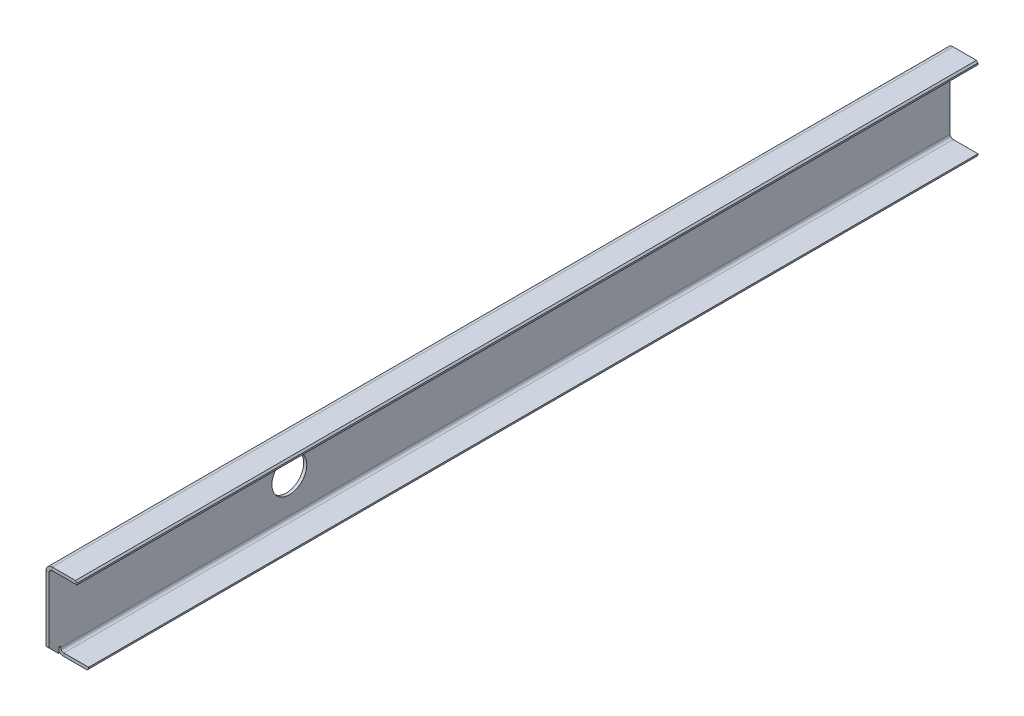
ISO-10303-21;
HEADER;
FILE_DESCRIPTION(('STEP AP214'),'2;1');
FILE_NAME('part.step','',(''),(''),'','','');
FILE_SCHEMA(('AUTOMOTIVE_DESIGN { 1 0 10303 214 1 1 1 1 }'));
ENDSEC;
DATA;
#1=APPLICATION_CONTEXT('core data for automotive mechanical design processes');
#2=APPLICATION_PROTOCOL_DEFINITION('international standard','automotive_design',2000,#1);
#3=PRODUCT_CONTEXT('',#1,'mechanical');
#4=PRODUCT('Part','Part','',(#3));
#5=PRODUCT_RELATED_PRODUCT_CATEGORY('part','',(#4));
#6=PRODUCT_DEFINITION_FORMATION('','',#4);
#7=PRODUCT_DEFINITION_CONTEXT('part definition',#1,'design');
#8=PRODUCT_DEFINITION('design','',#6,#7);
#9=PRODUCT_DEFINITION_SHAPE('','',#8);
#10=(LENGTH_UNIT() NAMED_UNIT(*) SI_UNIT(.MILLI.,.METRE.));
#11=(NAMED_UNIT(*) PLANE_ANGLE_UNIT() SI_UNIT($,.RADIAN.));
#12=(NAMED_UNIT(*) SI_UNIT($,.STERADIAN.) SOLID_ANGLE_UNIT());
#13=UNCERTAINTY_MEASURE_WITH_UNIT(LENGTH_MEASURE(1.E-05),#10,'distance_accuracy_value','');
#14=(GEOMETRIC_REPRESENTATION_CONTEXT(3) GLOBAL_UNCERTAINTY_ASSIGNED_CONTEXT((#13)) GLOBAL_UNIT_ASSIGNED_CONTEXT((#10,
#11,#12)) REPRESENTATION_CONTEXT('',''));
#15=CARTESIAN_POINT('',(0.,0.,0.));
#16=DIRECTION('',(0.,0.,1.));
#17=DIRECTION('',(1.,0.,0.));
#18=AXIS2_PLACEMENT_3D('',#15,#16,#17);
#19=CARTESIAN_POINT('',(-8.,0.,0.));
#20=DIRECTION('',(-1.,0.,0.));
#21=DIRECTION('',(0.,0.,1.));
#22=AXIS2_PLACEMENT_3D('',#19,#20,#21);
#23=PLANE('',#22);
#24=CARTESIAN_POINT('',(-8.00000000000007,-107.5,-620.));
#25=DIRECTION('',(1.,0.,0.));
#26=DIRECTION('',(0.,0.,-1.));
#27=AXIS2_PLACEMENT_3D('',#24,#25,#26);
#28=CIRCLE('',#27,45.0000000000001);
#29=CARTESIAN_POINT('',(-8.00000000000007,-107.5,-665.));
#30=VERTEX_POINT('',#29);
#31=EDGE_CURVE('E255',#30,#30,#28,.T.);
#32=ORIENTED_EDGE('',*,*,#31,.T.);
#33=EDGE_LOOP('',(#32));
#34=FACE_BOUND('',#33,.T.);
#35=DIRECTION('',(0.,1.,0.));
#36=VECTOR('',#35,1.);
#37=CARTESIAN_POINT('',(-8.,0.,-2325.));
#38=LINE('',#37,#36);
#39=CARTESIAN_POINT('',(-8.00000000000007,-199.,-2325.));
#40=VERTEX_POINT('',#39);
#41=CARTESIAN_POINT('',(-8.,-16.,-2325.));
#42=VERTEX_POINT('',#41);
#43=EDGE_CURVE('E354',#40,#42,#38,.T.);
#44=ORIENTED_EDGE('',*,*,#43,.F.);
#45=DIRECTION('',(0.,0.,-1.));
#46=VECTOR('',#45,1.);
#47=CARTESIAN_POINT('',(-8.00000000000007,-199.,-2325.));
#48=LINE('',#47,#46);
#49=CARTESIAN_POINT('',(-8.,-199.,-30.0000000000002));
#50=VERTEX_POINT('',#49);
#51=EDGE_CURVE('E208',#40,#50,#48,.F.);
#52=ORIENTED_EDGE('',*,*,#51,.T.);
#53=DIRECTION('',(0.,1.,0.));
#54=VECTOR('',#53,1.);
#55=CARTESIAN_POINT('',(-8.,0.,-30.0000000000002));
#56=LINE('',#55,#54);
#57=CARTESIAN_POINT('',(-8.,-195.,-30.0000000000002));
#58=VERTEX_POINT('',#57);
#59=EDGE_CURVE('E344',#50,#58,#56,.T.);
#60=ORIENTED_EDGE('',*,*,#59,.T.);
#61=DIRECTION('',(0.,0.,1.));
#62=VECTOR('',#61,1.);
#63=CARTESIAN_POINT('',(-8.,-195.,0.));
#64=LINE('',#63,#62);
#65=CARTESIAN_POINT('',(-8.,-195.,-26.0000000000002));
#66=VERTEX_POINT('',#65);
#67=EDGE_CURVE('E341',#58,#66,#64,.T.);
#68=ORIENTED_EDGE('',*,*,#67,.T.);
#69=DIRECTION('',(0.,-1.,0.));
#70=VECTOR('',#69,1.);
#71=CARTESIAN_POINT('',(-8.,0.,-26.0000000000002));
#72=LINE('',#71,#70);
#73=CARTESIAN_POINT('',(-8.,-211.,-26.0000000000003));
#74=VERTEX_POINT('',#73);
#75=EDGE_CURVE('E326',#66,#74,#72,.T.);
#76=ORIENTED_EDGE('',*,*,#75,.T.);
#77=DIRECTION('',(0.,-0.707106781186547,-0.707106781186547));
#78=VECTOR('',#77,1.);
#79=CARTESIAN_POINT('',(-8.,-215.,-30.));
#80=LINE('',#79,#78);
#81=CARTESIAN_POINT('',(-8.,-185.,0.));
#82=VERTEX_POINT('',#81);
#83=EDGE_CURVE('E350',#82,#74,#80,.T.);
#84=ORIENTED_EDGE('',*,*,#83,.F.);
#85=DIRECTION('',(0.,-1.,0.));
#86=VECTOR('',#85,1.);
#87=CARTESIAN_POINT('',(-8.,-185.,0.));
#88=LINE('',#87,#86);
#89=CARTESIAN_POINT('',(-8.,-16.,0.));
#90=VERTEX_POINT('',#89);
#91=EDGE_CURVE('E348',#90,#82,#88,.T.);
#92=ORIENTED_EDGE('',*,*,#91,.F.);
#93=DIRECTION('',(0.,0.,1.));
#94=VECTOR('',#93,1.);
#95=CARTESIAN_POINT('',(-8.,-16.,0.));
#96=LINE('',#95,#94);
#97=EDGE_CURVE('E300',#90,#42,#96,.F.);
#98=ORIENTED_EDGE('',*,*,#97,.T.);
#99=EDGE_LOOP('',(#44,#52,#60,#68,#76,#84,#92,#98));
#100=FACE_BOUND('',#99,.T.);
#101=ADVANCED_FACE('F78',(#34,#100),#23,.T.);
#102=CARTESIAN_POINT('',(0.,0.,0.));
#103=DIRECTION('',(-1.,0.,0.));
#104=DIRECTION('',(0.,0.,1.));
#105=AXIS2_PLACEMENT_3D('',#102,#103,#104);
#106=PLANE('',#105);
#107=CARTESIAN_POINT('',(0.,-107.5,-620.));
#108=DIRECTION('',(1.,0.,0.));
#109=DIRECTION('',(0.,0.,-1.));
#110=AXIS2_PLACEMENT_3D('',#107,#108,#109);
#111=CIRCLE('',#110,45.0000000000001);
#112=CARTESIAN_POINT('',(0.,-107.5,-665.));
#113=VERTEX_POINT('',#112);
#114=EDGE_CURVE('E442',#113,#113,#111,.T.);
#115=ORIENTED_EDGE('',*,*,#114,.F.);
#116=EDGE_LOOP('',(#115));
#117=FACE_BOUND('',#116,.T.);
#118=DIRECTION('',(0.,0.,-1.));
#119=VECTOR('',#118,1.);
#120=CARTESIAN_POINT('',(0.,-199.,-2325.));
#121=LINE('',#120,#119);
#122=CARTESIAN_POINT('',(0.,-199.,-2325.));
#123=VERTEX_POINT('',#122);
#124=CARTESIAN_POINT('',(0.,-199.,-30.0000000000002));
#125=VERTEX_POINT('',#124);
#126=EDGE_CURVE('E262',#123,#125,#121,.F.);
#127=ORIENTED_EDGE('',*,*,#126,.F.);
#128=DIRECTION('',(0.,1.,0.));
#129=VECTOR('',#128,1.);
#130=CARTESIAN_POINT('',(0.,0.,-2325.));
#131=LINE('',#130,#129);
#132=CARTESIAN_POINT('',(0.,-16.,-2325.));
#133=VERTEX_POINT('',#132);
#134=EDGE_CURVE('E351',#123,#133,#131,.T.);
#135=ORIENTED_EDGE('',*,*,#134,.T.);
#136=DIRECTION('',(0.,0.,1.));
#137=VECTOR('',#136,1.);
#138=CARTESIAN_POINT('',(0.,-16.,0.));
#139=LINE('',#138,#137);
#140=CARTESIAN_POINT('',(0.,-16.,0.));
#141=VERTEX_POINT('',#140);
#142=EDGE_CURVE('E313',#141,#133,#139,.F.);
#143=ORIENTED_EDGE('',*,*,#142,.F.);
#144=DIRECTION('',(0.,-1.,0.));
#145=VECTOR('',#144,1.);
#146=CARTESIAN_POINT('',(0.,-185.,0.));
#147=LINE('',#146,#145);
#148=CARTESIAN_POINT('',(0.,-185.,0.));
#149=VERTEX_POINT('',#148);
#150=EDGE_CURVE('E347',#141,#149,#147,.T.);
#151=ORIENTED_EDGE('',*,*,#150,.T.);
#152=DIRECTION('',(0.,-0.707106781186547,-0.707106781186547));
#153=VECTOR('',#152,1.);
#154=CARTESIAN_POINT('',(0.,-215.,-30.));
#155=LINE('',#154,#153);
#156=CARTESIAN_POINT('',(0.,-211.,-26.0000000000002));
#157=VERTEX_POINT('',#156);
#158=EDGE_CURVE('E359',#149,#157,#155,.T.);
#159=ORIENTED_EDGE('',*,*,#158,.T.);
#160=DIRECTION('',(0.,-1.,0.));
#161=VECTOR('',#160,1.);
#162=CARTESIAN_POINT('',(0.,-195.,-26.0000000000002));
#163=LINE('',#162,#161);
#164=CARTESIAN_POINT('',(0.,-195.,-26.0000000000002));
#165=VERTEX_POINT('',#164);
#166=EDGE_CURVE('E331',#165,#157,#163,.T.);
#167=ORIENTED_EDGE('',*,*,#166,.F.);
#168=DIRECTION('',(0.,0.,1.));
#169=VECTOR('',#168,1.);
#170=CARTESIAN_POINT('',(0.,-195.,-30.0000000000002));
#171=LINE('',#170,#169);
#172=CARTESIAN_POINT('',(0.,-195.,-30.0000000000002));
#173=VERTEX_POINT('',#172);
#174=EDGE_CURVE('E327',#173,#165,#171,.T.);
#175=ORIENTED_EDGE('',*,*,#174,.F.);
#176=DIRECTION('',(0.,1.,0.));
#177=VECTOR('',#176,1.);
#178=CARTESIAN_POINT('',(0.,-199.,-30.0000000000002));
#179=LINE('',#178,#177);
#180=EDGE_CURVE('E323',#125,#173,#179,.T.);
#181=ORIENTED_EDGE('',*,*,#180,.F.);
#182=EDGE_LOOP('',(#127,#135,#143,#151,#159,#167,#175,#181));
#183=FACE_BOUND('',#182,.T.);
#184=ADVANCED_FACE('F419',(#117,#183),#106,.F.);
#185=CARTESIAN_POINT('',(-8.,0.,-2325.));
#186=DIRECTION('',(0.,0.,-1.));
#187=DIRECTION('',(-1.,0.,0.));
#188=AXIS2_PLACEMENT_3D('',#185,#186,#187);
#189=PLANE('',#188);
#190=ORIENTED_EDGE('',*,*,#134,.F.);
#191=DIRECTION('',(-1.,0.,0.));
#192=VECTOR('',#191,1.);
#193=CARTESIAN_POINT('',(0.,-199.,-2325.));
#194=LINE('',#193,#192);
#195=EDGE_CURVE('E258',#123,#40,#194,.T.);
#196=ORIENTED_EDGE('',*,*,#195,.T.);
#197=ORIENTED_EDGE('',*,*,#43,.T.);
#198=DIRECTION('',(-1.,0.,0.));
#199=VECTOR('',#198,1.);
#200=CARTESIAN_POINT('',(0.,-16.,-2325.));
#201=LINE('',#200,#199);
#202=EDGE_CURVE('E317',#133,#42,#201,.T.);
#203=ORIENTED_EDGE('',*,*,#202,.F.);
#204=EDGE_LOOP('',(#190,#196,#197,#203));
#205=FACE_BOUND('',#204,.T.);
#206=ADVANCED_FACE('F425',(#205),#189,.T.);
#207=CARTESIAN_POINT('',(-8.,-215.,-30.));
#208=DIRECTION('',(0.,-0.707106781186547,0.707106781186547));
#209=DIRECTION('',(0.,-0.707106781186548,-0.707106781186548));
#210=AXIS2_PLACEMENT_3D('',#207,#208,#209);
#211=PLANE('',#210);
#212=ORIENTED_EDGE('',*,*,#83,.T.);
#213=DIRECTION('',(-1.,0.,0.));
#214=VECTOR('',#213,1.);
#215=CARTESIAN_POINT('',(0.,-211.,-26.0000000000003));
#216=LINE('',#215,#214);
#217=EDGE_CURVE('E333',#157,#74,#216,.T.);
#218=ORIENTED_EDGE('',*,*,#217,.F.);
#219=ORIENTED_EDGE('',*,*,#158,.F.);
#220=DIRECTION('',(1.,0.,0.));
#221=VECTOR('',#220,1.);
#222=CARTESIAN_POINT('',(-8.,-185.,0.));
#223=LINE('',#222,#221);
#224=EDGE_CURVE('E357',#82,#149,#223,.T.);
#225=ORIENTED_EDGE('',*,*,#224,.F.);
#226=EDGE_LOOP('',(#212,#218,#219,#225));
#227=FACE_BOUND('',#226,.T.);
#228=ADVANCED_FACE('F414',(#227),#211,.T.);
#229=CARTESIAN_POINT('',(-8.,-185.,0.));
#230=DIRECTION('',(0.,0.,1.));
#231=DIRECTION('',(1.,0.,0.));
#232=AXIS2_PLACEMENT_3D('',#229,#230,#231);
#233=PLANE('',#232);
#234=ORIENTED_EDGE('',*,*,#150,.F.);
#235=DIRECTION('',(-1.,0.,0.));
#236=VECTOR('',#235,1.);
#237=CARTESIAN_POINT('',(0.,-16.,0.));
#238=LINE('',#237,#236);
#239=EDGE_CURVE('E307',#141,#90,#238,.T.);
#240=ORIENTED_EDGE('',*,*,#239,.T.);
#241=ORIENTED_EDGE('',*,*,#91,.T.);
#242=ORIENTED_EDGE('',*,*,#224,.T.);
#243=EDGE_LOOP('',(#234,#240,#241,#242));
#244=FACE_BOUND('',#243,.T.);
#245=ADVANCED_FACE('F411',(#244),#233,.T.);
#246=CARTESIAN_POINT('',(0.,-199.,-30.0000000000002));
#247=DIRECTION('',(0.,0.,1.));
#248=DIRECTION('',(1.,0.,0.));
#249=AXIS2_PLACEMENT_3D('',#246,#247,#248);
#250=PLANE('',#249);
#251=ORIENTED_EDGE('',*,*,#59,.F.);
#252=DIRECTION('',(-1.,0.,0.));
#253=VECTOR('',#252,1.);
#254=CARTESIAN_POINT('',(0.,-199.,-30.0000000000002));
#255=LINE('',#254,#253);
#256=EDGE_CURVE('E266',#125,#50,#255,.T.);
#257=ORIENTED_EDGE('',*,*,#256,.F.);
#258=ORIENTED_EDGE('',*,*,#180,.T.);
#259=DIRECTION('',(-1.,0.,0.));
#260=VECTOR('',#259,1.);
#261=CARTESIAN_POINT('',(0.,-195.,-30.0000000000002));
#262=LINE('',#261,#260);
#263=EDGE_CURVE('E330',#173,#58,#262,.T.);
#264=ORIENTED_EDGE('',*,*,#263,.T.);
#265=EDGE_LOOP('',(#251,#257,#258,#264));
#266=FACE_BOUND('',#265,.T.);
#267=ADVANCED_FACE('F468',(#266),#250,.T.);
#268=CARTESIAN_POINT('',(0.,-195.,-30.0000000000002));
#269=DIRECTION('',(0.,-1.,0.));
#270=DIRECTION('',(0.,0.,-1.));
#271=AXIS2_PLACEMENT_3D('',#268,#269,#270);
#272=PLANE('',#271);
#273=ORIENTED_EDGE('',*,*,#67,.F.);
#274=ORIENTED_EDGE('',*,*,#263,.F.);
#275=ORIENTED_EDGE('',*,*,#174,.T.);
#276=DIRECTION('',(-1.,0.,0.));
#277=VECTOR('',#276,1.);
#278=CARTESIAN_POINT('',(0.,-195.,-26.0000000000002));
#279=LINE('',#278,#277);
#280=EDGE_CURVE('E320',#165,#66,#279,.T.);
#281=ORIENTED_EDGE('',*,*,#280,.T.);
#282=EDGE_LOOP('',(#273,#274,#275,#281));
#283=FACE_BOUND('',#282,.T.);
#284=ADVANCED_FACE('F517',(#283),#272,.T.);
#285=CARTESIAN_POINT('',(0.,-195.,-26.0000000000002));
#286=DIRECTION('',(0.,0.,-1.));
#287=DIRECTION('',(0.,1.,0.));
#288=AXIS2_PLACEMENT_3D('',#285,#286,#287);
#289=PLANE('',#288);
#290=ORIENTED_EDGE('',*,*,#75,.F.);
#291=ORIENTED_EDGE('',*,*,#280,.F.);
#292=ORIENTED_EDGE('',*,*,#166,.T.);
#293=ORIENTED_EDGE('',*,*,#217,.T.);
#294=EDGE_LOOP('',(#290,#291,#292,#293));
#295=FACE_BOUND('',#294,.T.);
#296=ADVANCED_FACE('F512',(#295),#289,.T.);
#297=CARTESIAN_POINT('',(8.,-16.,-2325.));
#298=DIRECTION('',(0.,0.,-1.));
#299=DIRECTION('',(-1.,0.,0.));
#300=AXIS2_PLACEMENT_3D('',#297,#298,#299);
#301=PLANE('',#300);
#302=DIRECTION('',(0.,-1.,0.));
#303=VECTOR('',#302,1.);
#304=CARTESIAN_POINT('',(7.99999999999994,0.,-2325.));
#305=LINE('',#304,#303);
#306=CARTESIAN_POINT('',(7.99999999999997,-7.99999999999997,-2325.));
#307=VERTEX_POINT('',#306);
#308=CARTESIAN_POINT('',(7.99999999999994,0.,-2325.));
#309=VERTEX_POINT('',#308);
#310=EDGE_CURVE('E269',#307,#309,#305,.F.);
#311=ORIENTED_EDGE('',*,*,#310,.F.);
#312=CARTESIAN_POINT('',(8.,-16.,-2325.));
#313=DIRECTION('',(0.,0.,1.));
#314=DIRECTION('',(1.,0.,0.));
#315=AXIS2_PLACEMENT_3D('',#312,#313,#314);
#316=CIRCLE('',#315,8.);
#317=EDGE_CURVE('E310',#133,#307,#316,.F.);
#318=ORIENTED_EDGE('',*,*,#317,.F.);
#319=ORIENTED_EDGE('',*,*,#202,.T.);
#320=CARTESIAN_POINT('',(8.,-16.,-2325.));
#321=DIRECTION('',(0.,0.,1.));
#322=DIRECTION('',(1.,0.,0.));
#323=AXIS2_PLACEMENT_3D('',#320,#321,#322);
#324=CIRCLE('',#323,16.);
#325=EDGE_CURVE('E303',#42,#309,#324,.F.);
#326=ORIENTED_EDGE('',*,*,#325,.T.);
#327=EDGE_LOOP('',(#311,#318,#319,#326));
#328=FACE_BOUND('',#327,.T.);
#329=ADVANCED_FACE('F387',(#328),#301,.T.);
#330=CARTESIAN_POINT('',(8.,-16.,0.));
#331=DIRECTION('',(0.,0.,-1.));
#332=DIRECTION('',(-1.,0.,0.));
#333=AXIS2_PLACEMENT_3D('',#330,#331,#332);
#334=PLANE('',#333);
#335=CARTESIAN_POINT('',(8.,-16.,0.));
#336=DIRECTION('',(0.,0.,1.));
#337=DIRECTION('',(1.,0.,0.));
#338=AXIS2_PLACEMENT_3D('',#335,#336,#337);
#339=CIRCLE('',#338,8.);
#340=CARTESIAN_POINT('',(7.99999999999997,-7.99999999999997,0.));
#341=VERTEX_POINT('',#340);
#342=EDGE_CURVE('E273',#341,#141,#339,.T.);
#343=ORIENTED_EDGE('',*,*,#342,.F.);
#344=DIRECTION('',(0.,-1.,0.));
#345=VECTOR('',#344,1.);
#346=CARTESIAN_POINT('',(7.99999999999997,-7.99999999999997,0.));
#347=LINE('',#346,#345);
#348=CARTESIAN_POINT('',(7.99999999999994,0.,0.));
#349=VERTEX_POINT('',#348);
#350=EDGE_CURVE('E293',#341,#349,#347,.F.);
#351=ORIENTED_EDGE('',*,*,#350,.T.);
#352=CARTESIAN_POINT('',(8.,-16.,0.));
#353=DIRECTION('',(0.,0.,1.));
#354=DIRECTION('',(1.,0.,0.));
#355=AXIS2_PLACEMENT_3D('',#352,#353,#354);
#356=CIRCLE('',#355,16.);
#357=EDGE_CURVE('E304',#349,#90,#356,.T.);
#358=ORIENTED_EDGE('',*,*,#357,.T.);
#359=ORIENTED_EDGE('',*,*,#239,.F.);
#360=EDGE_LOOP('',(#343,#351,#358,#359));
#361=FACE_BOUND('',#360,.T.);
#362=ADVANCED_FACE('F401',(#361),#334,.F.);
#363=CARTESIAN_POINT('',(8.,-16.,0.));
#364=DIRECTION('',(0.,0.,1.));
#365=DIRECTION('',(0.,1.,0.));
#366=AXIS2_PLACEMENT_3D('',#363,#364,#365);
#367=CYLINDRICAL_SURFACE('',#366,16.);
#368=ORIENTED_EDGE('',*,*,#97,.F.);
#369=ORIENTED_EDGE('',*,*,#357,.F.);
#370=DIRECTION('',(0.,0.,1.));
#371=VECTOR('',#370,1.);
#372=CARTESIAN_POINT('',(7.99999999999994,0.,-2325.));
#373=LINE('',#372,#371);
#374=EDGE_CURVE('E290',#349,#309,#373,.F.);
#375=ORIENTED_EDGE('',*,*,#374,.T.);
#376=ORIENTED_EDGE('',*,*,#325,.F.);
#377=EDGE_LOOP('',(#368,#369,#375,#376));
#378=FACE_BOUND('',#377,.T.);
#379=ADVANCED_FACE('F403',(#378),#367,.T.);
#380=CARTESIAN_POINT('',(8.,-16.,0.));
#381=DIRECTION('',(0.,0.,1.));
#382=DIRECTION('',(0.,1.,0.));
#383=AXIS2_PLACEMENT_3D('',#380,#381,#382);
#384=CYLINDRICAL_SURFACE('',#383,8.);
#385=ORIENTED_EDGE('',*,*,#142,.T.);
#386=ORIENTED_EDGE('',*,*,#317,.T.);
#387=DIRECTION('',(0.,0.,1.));
#388=VECTOR('',#387,1.);
#389=CARTESIAN_POINT('',(7.99999999999997,-7.99999999999997,-2325.));
#390=LINE('',#389,#388);
#391=EDGE_CURVE('E296',#307,#341,#390,.T.);
#392=ORIENTED_EDGE('',*,*,#391,.T.);
#393=ORIENTED_EDGE('',*,*,#342,.T.);
#394=EDGE_LOOP('',(#385,#386,#392,#393));
#395=FACE_BOUND('',#394,.T.);
#396=ADVANCED_FACE('F390',(#395),#384,.F.);
#397=CARTESIAN_POINT('',(72.,2.51534904016637E-13,0.));
#398=DIRECTION('',(0.,0.,-1.));
#399=DIRECTION('',(-1.,0.,0.));
#400=AXIS2_PLACEMENT_3D('',#397,#398,#399);
#401=PLANE('',#400);
#402=DIRECTION('',(0.,-1.,0.));
#403=VECTOR('',#402,1.);
#404=CARTESIAN_POINT('',(72.,2.51534904016637E-13,0.));
#405=LINE('',#404,#403);
#406=CARTESIAN_POINT('',(72.,-3.99999999999977,0.));
#407=VERTEX_POINT('',#406);
#408=CARTESIAN_POINT('',(72.,-7.99999999999975,0.));
#409=VERTEX_POINT('',#408);
#410=EDGE_CURVE('E271',#407,#409,#405,.T.);
#411=ORIENTED_EDGE('',*,*,#410,.F.);
#412=DIRECTION('',(0.707106781186528,-0.707106781186567,0.));
#413=VECTOR('',#412,1.);
#414=CARTESIAN_POINT('',(68.0000000000002,2.37420731041334E-13,0.));
#415=LINE('',#414,#413);
#416=CARTESIAN_POINT('',(68.0000000000002,2.37420731041334E-13,0.));
#417=VERTEX_POINT('',#416);
#418=EDGE_CURVE('E13',#407,#417,#415,.F.);
#419=ORIENTED_EDGE('',*,*,#418,.T.);
#420=DIRECTION('',(1.,0.,0.));
#421=VECTOR('',#420,1.);
#422=CARTESIAN_POINT('',(0.,0.,0.));
#423=LINE('',#422,#421);
#424=EDGE_CURVE('E278',#349,#417,#423,.T.);
#425=ORIENTED_EDGE('',*,*,#424,.F.);
#426=ORIENTED_EDGE('',*,*,#350,.F.);
#427=DIRECTION('',(-1.,0.,0.));
#428=VECTOR('',#427,1.);
#429=CARTESIAN_POINT('',(72.,-7.99999999999975,0.));
#430=LINE('',#429,#428);
#431=EDGE_CURVE('E287',#341,#409,#430,.F.);
#432=ORIENTED_EDGE('',*,*,#431,.T.);
#433=EDGE_LOOP('',(#411,#419,#425,#426,#432));
#434=FACE_BOUND('',#433,.T.);
#435=ADVANCED_FACE('F399',(#434),#401,.F.);
#436=CARTESIAN_POINT('',(0.,0.,-2325.));
#437=DIRECTION('',(0.,0.,1.));
#438=DIRECTION('',(1.,0.,0.));
#439=AXIS2_PLACEMENT_3D('',#436,#437,#438);
#440=PLANE('',#439);
#441=DIRECTION('',(-1.,0.,0.));
#442=VECTOR('',#441,1.);
#443=CARTESIAN_POINT('',(0.,0.,-2325.));
#444=LINE('',#443,#442);
#445=CARTESIAN_POINT('',(68.0000000000002,2.37420731041334E-13,-2325.));
#446=VERTEX_POINT('',#445);
#447=EDGE_CURVE('E276',#446,#309,#444,.T.);
#448=ORIENTED_EDGE('',*,*,#447,.F.);
#449=DIRECTION('',(-0.707106781186528,0.707106781186567,0.));
#450=VECTOR('',#449,1.);
#451=CARTESIAN_POINT('',(68.0000000000002,2.37420731041334E-13,-2325.));
#452=LINE('',#451,#450);
#453=CARTESIAN_POINT('',(72.,-3.99999999999977,-2325.));
#454=VERTEX_POINT('',#453);
#455=EDGE_CURVE('E100',#446,#454,#452,.F.);
#456=ORIENTED_EDGE('',*,*,#455,.T.);
#457=DIRECTION('',(0.,-1.,0.));
#458=VECTOR('',#457,1.);
#459=CARTESIAN_POINT('',(72.,2.51386656396706E-13,-2325.));
#460=LINE('',#459,#458);
#461=CARTESIAN_POINT('',(72.,-7.99999999999975,-2325.));
#462=VERTEX_POINT('',#461);
#463=EDGE_CURVE('E274',#454,#462,#460,.T.);
#464=ORIENTED_EDGE('',*,*,#463,.T.);
#465=DIRECTION('',(1.,0.,0.));
#466=VECTOR('',#465,1.);
#467=CARTESIAN_POINT('',(0.,-8.,-2325.));
#468=LINE('',#467,#466);
#469=EDGE_CURVE('E281',#462,#307,#468,.F.);
#470=ORIENTED_EDGE('',*,*,#469,.T.);
#471=ORIENTED_EDGE('',*,*,#310,.T.);
#472=EDGE_LOOP('',(#448,#456,#464,#470,#471));
#473=FACE_BOUND('',#472,.T.);
#474=ADVANCED_FACE('F383',(#473),#440,.F.);
#475=CARTESIAN_POINT('',(0.,0.,0.));
#476=DIRECTION('',(0.,-1.,0.));
#477=DIRECTION('',(1.,0.,0.));
#478=AXIS2_PLACEMENT_3D('',#475,#476,#477);
#479=PLANE('',#478);
#480=ORIENTED_EDGE('',*,*,#424,.T.);
#481=DIRECTION('',(0.,0.,-1.));
#482=VECTOR('',#481,1.);
#483=CARTESIAN_POINT('',(68.0000000000002,2.37420731041334E-13,0.));
#484=LINE('',#483,#482);
#485=EDGE_CURVE('E373',#417,#446,#484,.T.);
#486=ORIENTED_EDGE('',*,*,#485,.T.);
#487=ORIENTED_EDGE('',*,*,#447,.T.);
#488=ORIENTED_EDGE('',*,*,#374,.F.);
#489=EDGE_LOOP('',(#480,#486,#487,#488));
#490=FACE_BOUND('',#489,.T.);
#491=ADVANCED_FACE('F378',(#490),#479,.F.);
#492=CARTESIAN_POINT('',(0.,-8.,0.));
#493=DIRECTION('',(0.,-1.,0.));
#494=DIRECTION('',(1.,0.,0.));
#495=AXIS2_PLACEMENT_3D('',#492,#493,#494);
#496=PLANE('',#495);
#497=ORIENTED_EDGE('',*,*,#431,.F.);
#498=ORIENTED_EDGE('',*,*,#391,.F.);
#499=ORIENTED_EDGE('',*,*,#469,.F.);
#500=DIRECTION('',(0.,0.,1.));
#501=VECTOR('',#500,1.);
#502=CARTESIAN_POINT('',(72.,-7.99999999999975,-2325.));
#503=LINE('',#502,#501);
#504=EDGE_CURVE('E284',#409,#462,#503,.F.);
#505=ORIENTED_EDGE('',*,*,#504,.F.);
#506=EDGE_LOOP('',(#497,#498,#499,#505));
#507=FACE_BOUND('',#506,.T.);
#508=ADVANCED_FACE('F395',(#507),#496,.T.);
#509=CARTESIAN_POINT('',(72.,2.51534904016637E-13,-2325.));
#510=DIRECTION('',(-1.,0.,0.));
#511=DIRECTION('',(0.,-1.,0.));
#512=AXIS2_PLACEMENT_3D('',#509,#510,#511);
#513=PLANE('',#512);
#514=ORIENTED_EDGE('',*,*,#463,.F.);
#515=DIRECTION('',(0.,0.,1.));
#516=VECTOR('',#515,1.);
#517=CARTESIAN_POINT('',(72.,-3.99999999999977,-2325.));
#518=LINE('',#517,#516);
#519=EDGE_CURVE('E86',#454,#407,#518,.T.);
#520=ORIENTED_EDGE('',*,*,#519,.T.);
#521=ORIENTED_EDGE('',*,*,#410,.T.);
#522=ORIENTED_EDGE('',*,*,#504,.T.);
#523=EDGE_LOOP('',(#514,#520,#521,#522));
#524=FACE_BOUND('',#523,.T.);
#525=ADVANCED_FACE('F492',(#524),#513,.F.);
#526=CARTESIAN_POINT('',(8.00000000000005,-199.,-30.0000000000002));
#527=DIRECTION('',(0.,0.,1.));
#528=DIRECTION('',(1.,0.,0.));
#529=AXIS2_PLACEMENT_3D('',#526,#527,#528);
#530=PLANE('',#529);
#531=DIRECTION('',(0.,1.,0.));
#532=VECTOR('',#531,1.);
#533=CARTESIAN_POINT('',(7.99999999999995,-215.,-30.));
#534=LINE('',#533,#532);
#535=CARTESIAN_POINT('',(8.00000000000002,-207.,-30.0000000000002));
#536=VERTEX_POINT('',#535);
#537=CARTESIAN_POINT('',(7.99999999999999,-215.,-30.0000000000002));
#538=VERTEX_POINT('',#537);
#539=EDGE_CURVE('E252',#536,#538,#534,.F.);
#540=ORIENTED_EDGE('',*,*,#539,.F.);
#541=CARTESIAN_POINT('',(8.00000000000005,-199.,-30.0000000000002));
#542=DIRECTION('',(0.,0.,-1.));
#543=DIRECTION('',(-1.,0.,0.));
#544=AXIS2_PLACEMENT_3D('',#541,#542,#543);
#545=CIRCLE('',#544,8.00000000000012);
#546=EDGE_CURVE('E211',#125,#536,#545,.F.);
#547=ORIENTED_EDGE('',*,*,#546,.F.);
#548=ORIENTED_EDGE('',*,*,#256,.T.);
#549=CARTESIAN_POINT('',(8.00000000000005,-199.,-30.0000000000002));
#550=DIRECTION('',(0.,0.,-1.));
#551=DIRECTION('',(-1.,0.,0.));
#552=AXIS2_PLACEMENT_3D('',#549,#550,#551);
#553=CIRCLE('',#552,16.0000000000001);
#554=EDGE_CURVE('E257',#50,#538,#553,.F.);
#555=ORIENTED_EDGE('',*,*,#554,.T.);
#556=EDGE_LOOP('',(#540,#547,#548,#555));
#557=FACE_BOUND('',#556,.T.);
#558=ADVANCED_FACE('F489',(#557),#530,.T.);
#559=CARTESIAN_POINT('',(8.00000000000005,-199.,-2325.));
#560=DIRECTION('',(0.,0.,1.));
#561=DIRECTION('',(1.,0.,0.));
#562=AXIS2_PLACEMENT_3D('',#559,#560,#561);
#563=PLANE('',#562);
#564=CARTESIAN_POINT('',(8.00000000000005,-199.,-2325.));
#565=DIRECTION('',(0.,0.,-1.));
#566=DIRECTION('',(-1.,0.,0.));
#567=AXIS2_PLACEMENT_3D('',#564,#565,#566);
#568=CIRCLE('',#567,8.00000000000012);
#569=CARTESIAN_POINT('',(8.00000000000002,-207.,-2325.));
#570=VERTEX_POINT('',#569);
#571=EDGE_CURVE('E218',#570,#123,#568,.T.);
#572=ORIENTED_EDGE('',*,*,#571,.F.);
#573=DIRECTION('',(0.,1.,0.));
#574=VECTOR('',#573,1.);
#575=CARTESIAN_POINT('',(8.00000000000006,-207.,-2325.));
#576=LINE('',#575,#574);
#577=CARTESIAN_POINT('',(8.00000000000004,-215.,-2325.));
#578=VERTEX_POINT('',#577);
#579=EDGE_CURVE('E215',#570,#578,#576,.F.);
#580=ORIENTED_EDGE('',*,*,#579,.T.);
#581=CARTESIAN_POINT('',(8.00000000000005,-199.,-2325.));
#582=DIRECTION('',(0.,0.,-1.));
#583=DIRECTION('',(-1.,0.,0.));
#584=AXIS2_PLACEMENT_3D('',#581,#582,#583);
#585=CIRCLE('',#584,16.0000000000001);
#586=EDGE_CURVE('E201',#578,#40,#585,.T.);
#587=ORIENTED_EDGE('',*,*,#586,.T.);
#588=ORIENTED_EDGE('',*,*,#195,.F.);
#589=EDGE_LOOP('',(#572,#580,#587,#588));
#590=FACE_BOUND('',#589,.T.);
#591=ADVANCED_FACE('F216',(#590),#563,.F.);
#592=CARTESIAN_POINT('',(8.00000000000005,-199.,-2325.));
#593=DIRECTION('',(0.,0.,-1.));
#594=DIRECTION('',(0.,-1.,0.));
#595=AXIS2_PLACEMENT_3D('',#592,#593,#594);
#596=CYLINDRICAL_SURFACE('',#595,16.0000000000001);
#597=ORIENTED_EDGE('',*,*,#51,.F.);
#598=ORIENTED_EDGE('',*,*,#586,.F.);
#599=DIRECTION('',(0.,0.,-1.));
#600=VECTOR('',#599,1.);
#601=CARTESIAN_POINT('',(7.99999999999995,-215.,0.));
#602=LINE('',#601,#600);
#603=EDGE_CURVE('E205',#538,#578,#602,.T.);
#604=ORIENTED_EDGE('',*,*,#603,.F.);
#605=ORIENTED_EDGE('',*,*,#554,.F.);
#606=EDGE_LOOP('',(#597,#598,#604,#605));
#607=FACE_BOUND('',#606,.T.);
#608=ADVANCED_FACE('F203',(#607),#596,.T.);
#609=CARTESIAN_POINT('',(8.00000000000005,-199.,-2325.));
#610=DIRECTION('',(0.,0.,-1.));
#611=DIRECTION('',(0.,-1.,0.));
#612=AXIS2_PLACEMENT_3D('',#609,#610,#611);
#613=CYLINDRICAL_SURFACE('',#612,8.00000000000012);
#614=ORIENTED_EDGE('',*,*,#126,.T.);
#615=ORIENTED_EDGE('',*,*,#546,.T.);
#616=DIRECTION('',(0.,0.,1.));
#617=VECTOR('',#616,1.);
#618=CARTESIAN_POINT('',(7.99999999999998,-207.,-30.));
#619=LINE('',#618,#617);
#620=EDGE_CURVE('E223',#536,#570,#619,.F.);
#621=ORIENTED_EDGE('',*,*,#620,.T.);
#622=ORIENTED_EDGE('',*,*,#571,.T.);
#623=EDGE_LOOP('',(#614,#615,#621,#622));
#624=FACE_BOUND('',#623,.T.);
#625=ADVANCED_FACE('F427',(#624),#613,.F.);
#626=CARTESIAN_POINT('',(0.,-215.,-2325.));
#627=DIRECTION('',(0.,0.,1.));
#628=DIRECTION('',(0.,-1.,0.));
#629=AXIS2_PLACEMENT_3D('',#626,#627,#628);
#630=PLANE('',#629);
#631=DIRECTION('',(0.,1.,0.));
#632=VECTOR('',#631,1.);
#633=CARTESIAN_POINT('',(72.,-215.,-2325.));
#634=LINE('',#633,#632);
#635=CARTESIAN_POINT('',(72.,-211.,-2325.));
#636=VERTEX_POINT('',#635);
#637=CARTESIAN_POINT('',(72.,-207.,-2325.));
#638=VERTEX_POINT('',#637);
#639=EDGE_CURVE('E265',#636,#638,#634,.T.);
#640=ORIENTED_EDGE('',*,*,#639,.F.);
#641=DIRECTION('',(-0.707106781186526,-0.707106781186569,0.));
#642=VECTOR('',#641,1.);
#643=CARTESIAN_POINT('',(68.0000000000002,-215.,-2325.));
#644=LINE('',#643,#642);
#645=CARTESIAN_POINT('',(68.0000000000003,-215.,-2325.));
#646=VERTEX_POINT('',#645);
#647=EDGE_CURVE('E238',#636,#646,#644,.T.);
#648=ORIENTED_EDGE('',*,*,#647,.T.);
#649=DIRECTION('',(-1.,0.,0.));
#650=VECTOR('',#649,1.);
#651=CARTESIAN_POINT('',(-7.73862945380772E-13,-215.,-2325.));
#652=LINE('',#651,#650);
#653=EDGE_CURVE('E229',#578,#646,#652,.F.);
#654=ORIENTED_EDGE('',*,*,#653,.F.);
#655=ORIENTED_EDGE('',*,*,#579,.F.);
#656=DIRECTION('',(1.,0.,0.));
#657=VECTOR('',#656,1.);
#658=CARTESIAN_POINT('',(0.,-207.,-2325.));
#659=LINE('',#658,#657);
#660=EDGE_CURVE('E233',#570,#638,#659,.T.);
#661=ORIENTED_EDGE('',*,*,#660,.T.);
#662=EDGE_LOOP('',(#640,#648,#654,#655,#661));
#663=FACE_BOUND('',#662,.T.);
#664=ADVANCED_FACE('F236',(#663),#630,.F.);
#665=CARTESIAN_POINT('',(72.,-215.,-30.));
#666=DIRECTION('',(0.,0.,-1.));
#667=DIRECTION('',(-1.,0.,0.));
#668=AXIS2_PLACEMENT_3D('',#665,#666,#667);
#669=PLANE('',#668);
#670=DIRECTION('',(1.,0.,0.));
#671=VECTOR('',#670,1.);
#672=CARTESIAN_POINT('',(-7.65189328000888E-13,-215.,-30.));
#673=LINE('',#672,#671);
#674=CARTESIAN_POINT('',(68.0000000000003,-215.,-30.));
#675=VERTEX_POINT('',#674);
#676=EDGE_CURVE('E232',#675,#538,#673,.F.);
#677=ORIENTED_EDGE('',*,*,#676,.F.);
#678=DIRECTION('',(0.707106781186526,0.707106781186569,0.));
#679=VECTOR('',#678,1.);
#680=CARTESIAN_POINT('',(68.0000000000002,-215.,-30.));
#681=LINE('',#680,#679);
#682=CARTESIAN_POINT('',(72.,-211.,-30.));
#683=VERTEX_POINT('',#682);
#684=EDGE_CURVE('E368',#675,#683,#681,.T.);
#685=ORIENTED_EDGE('',*,*,#684,.T.);
#686=DIRECTION('',(0.,1.,0.));
#687=VECTOR('',#686,1.);
#688=CARTESIAN_POINT('',(72.,-215.,-30.));
#689=LINE('',#688,#687);
#690=CARTESIAN_POINT('',(72.,-207.,-29.9999999999999));
#691=VERTEX_POINT('',#690);
#692=EDGE_CURVE('E241',#683,#691,#689,.T.);
#693=ORIENTED_EDGE('',*,*,#692,.T.);
#694=DIRECTION('',(-1.,0.,0.));
#695=VECTOR('',#694,1.);
#696=CARTESIAN_POINT('',(72.,-207.,-30.));
#697=LINE('',#696,#695);
#698=EDGE_CURVE('E239',#691,#536,#697,.T.);
#699=ORIENTED_EDGE('',*,*,#698,.T.);
#700=ORIENTED_EDGE('',*,*,#539,.T.);
#701=EDGE_LOOP('',(#677,#685,#693,#699,#700));
#702=FACE_BOUND('',#701,.T.);
#703=ADVANCED_FACE('F435',(#702),#669,.F.);
#704=CARTESIAN_POINT('',(-7.73862945380773E-13,-215.,0.));
#705=DIRECTION('',(0.,-1.,0.));
#706=DIRECTION('',(1.,0.,0.));
#707=AXIS2_PLACEMENT_3D('',#704,#705,#706);
#708=PLANE('',#707);
#709=ORIENTED_EDGE('',*,*,#653,.T.);
#710=DIRECTION('',(0.,0.,1.));
#711=VECTOR('',#710,1.);
#712=CARTESIAN_POINT('',(68.0000000000003,-215.,-30.));
#713=LINE('',#712,#711);
#714=EDGE_CURVE('E366',#646,#675,#713,.T.);
#715=ORIENTED_EDGE('',*,*,#714,.T.);
#716=ORIENTED_EDGE('',*,*,#676,.T.);
#717=ORIENTED_EDGE('',*,*,#603,.T.);
#718=EDGE_LOOP('',(#709,#715,#716,#717));
#719=FACE_BOUND('',#718,.T.);
#720=ADVANCED_FACE('F227',(#719),#708,.T.);
#721=CARTESIAN_POINT('',(-7.45931094670027E-13,-207.,0.));
#722=DIRECTION('',(0.,-1.,0.));
#723=DIRECTION('',(1.,0.,0.));
#724=AXIS2_PLACEMENT_3D('',#721,#722,#723);
#725=PLANE('',#724);
#726=ORIENTED_EDGE('',*,*,#620,.F.);
#727=ORIENTED_EDGE('',*,*,#698,.F.);
#728=DIRECTION('',(0.,0.,1.));
#729=VECTOR('',#728,1.);
#730=CARTESIAN_POINT('',(72.,-207.,-2325.));
#731=LINE('',#730,#729);
#732=EDGE_CURVE('E244',#638,#691,#731,.T.);
#733=ORIENTED_EDGE('',*,*,#732,.F.);
#734=ORIENTED_EDGE('',*,*,#660,.F.);
#735=EDGE_LOOP('',(#726,#727,#733,#734));
#736=FACE_BOUND('',#735,.T.);
#737=ADVANCED_FACE('F432',(#736),#725,.F.);
#738=CARTESIAN_POINT('',(72.,-215.,-2325.));
#739=DIRECTION('',(-1.,0.,0.));
#740=DIRECTION('',(0.,-1.,0.));
#741=AXIS2_PLACEMENT_3D('',#738,#739,#740);
#742=PLANE('',#741);
#743=ORIENTED_EDGE('',*,*,#692,.F.);
#744=DIRECTION('',(0.,0.,-1.));
#745=VECTOR('',#744,1.);
#746=CARTESIAN_POINT('',(72.,-211.,-2325.));
#747=LINE('',#746,#745);
#748=EDGE_CURVE('E370',#683,#636,#747,.T.);
#749=ORIENTED_EDGE('',*,*,#748,.T.);
#750=ORIENTED_EDGE('',*,*,#639,.T.);
#751=ORIENTED_EDGE('',*,*,#732,.T.);
#752=EDGE_LOOP('',(#743,#749,#750,#751));
#753=FACE_BOUND('',#752,.T.);
#754=ADVANCED_FACE('F439',(#753),#742,.F.);
#755=CARTESIAN_POINT('',(68.0000000000002,-215.,0.));
#756=DIRECTION('',(0.707106781186569,-0.707106781186526,0.));
#757=DIRECTION('',(0.,0.,-1.));
#758=AXIS2_PLACEMENT_3D('',#755,#756,#757);
#759=PLANE('',#758);
#760=ORIENTED_EDGE('',*,*,#647,.F.);
#761=ORIENTED_EDGE('',*,*,#748,.F.);
#762=ORIENTED_EDGE('',*,*,#684,.F.);
#763=ORIENTED_EDGE('',*,*,#714,.F.);
#764=EDGE_LOOP('',(#760,#761,#762,#763));
#765=FACE_BOUND('',#764,.T.);
#766=ADVANCED_FACE('F469',(#765),#759,.T.);
#767=CARTESIAN_POINT('',(68.0000000000002,2.37420731041334E-13,0.));
#768=DIRECTION('',(-0.707106781186567,-0.707106781186528,0.));
#769=DIRECTION('',(0.,0.,-1.));
#770=AXIS2_PLACEMENT_3D('',#767,#768,#769);
#771=PLANE('',#770);
#772=ORIENTED_EDGE('',*,*,#418,.F.);
#773=ORIENTED_EDGE('',*,*,#519,.F.);
#774=ORIENTED_EDGE('',*,*,#455,.F.);
#775=ORIENTED_EDGE('',*,*,#485,.F.);
#776=EDGE_LOOP('',(#772,#773,#774,#775));
#777=FACE_BOUND('',#776,.T.);
#778=ADVANCED_FACE('F80',(#777),#771,.F.);
#779=CARTESIAN_POINT('',(-8.00000000000007,-107.5,-620.));
#780=DIRECTION('',(1.,0.,0.));
#781=DIRECTION('',(0.,0.,-1.));
#782=AXIS2_PLACEMENT_3D('',#779,#780,#781);
#783=CYLINDRICAL_SURFACE('',#782,45.0000000000001);
#784=ORIENTED_EDGE('',*,*,#31,.F.);
#785=EDGE_LOOP('',(#784));
#786=FACE_BOUND('',#785,.T.);
#787=ORIENTED_EDGE('',*,*,#114,.T.);
#788=EDGE_LOOP('',(#787));
#789=FACE_BOUND('',#788,.T.);
#790=ADVANCED_FACE('F449',(#786,#789),#783,.F.);
#791=CLOSED_SHELL('',(#101,#184,#206,#228,#245,#267,#284,#296,#329,#362,#379,#396,#435,#474,
#491,#508,#525,#558,#591,#608,#625,#664,#703,#720,#737,#754,#766,#778,#790));
#792=MANIFOLD_SOLID_BREP('B2',#791);
#793=ADVANCED_BREP_SHAPE_REPRESENTATION('',(#18,#792),#14);
#794=SHAPE_DEFINITION_REPRESENTATION(#9,#793);
ENDSEC;
END-ISO-10303-21;
